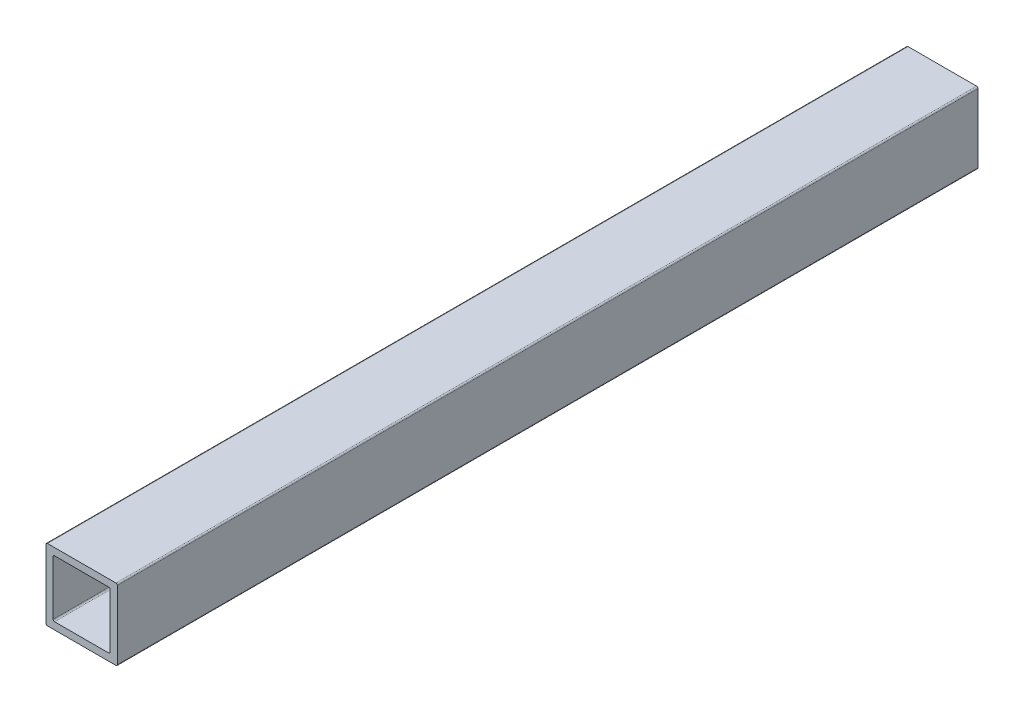
ISO-10303-21;
HEADER;
FILE_DESCRIPTION(('STEP AP214'),'2;1');
FILE_NAME('part.step','',(''),(''),'','','');
FILE_SCHEMA(('AUTOMOTIVE_DESIGN { 1 0 10303 214 1 1 1 1 }'));
ENDSEC;
DATA;
#1=APPLICATION_CONTEXT('core data for automotive mechanical design processes');
#2=APPLICATION_PROTOCOL_DEFINITION('international standard','automotive_design',2000,#1);
#3=PRODUCT_CONTEXT('',#1,'mechanical');
#4=PRODUCT('Part','Part','',(#3));
#5=PRODUCT_RELATED_PRODUCT_CATEGORY('part','',(#4));
#6=PRODUCT_DEFINITION_FORMATION('','',#4);
#7=PRODUCT_DEFINITION_CONTEXT('part definition',#1,'design');
#8=PRODUCT_DEFINITION('design','',#6,#7);
#9=PRODUCT_DEFINITION_SHAPE('','',#8);
#10=(LENGTH_UNIT() NAMED_UNIT(*) SI_UNIT(.MILLI.,.METRE.));
#11=(NAMED_UNIT(*) PLANE_ANGLE_UNIT() SI_UNIT($,.RADIAN.));
#12=(NAMED_UNIT(*) SI_UNIT($,.STERADIAN.) SOLID_ANGLE_UNIT());
#13=UNCERTAINTY_MEASURE_WITH_UNIT(LENGTH_MEASURE(1.E-05),#10,'distance_accuracy_value','');
#14=(GEOMETRIC_REPRESENTATION_CONTEXT(3) GLOBAL_UNCERTAINTY_ASSIGNED_CONTEXT((#13)) GLOBAL_UNIT_ASSIGNED_CONTEXT((#10,
#11,#12)) REPRESENTATION_CONTEXT('',''));
#15=CARTESIAN_POINT('',(0.,0.,0.));
#16=DIRECTION('',(0.,0.,1.));
#17=DIRECTION('',(1.,0.,0.));
#18=AXIS2_PLACEMENT_3D('',#15,#16,#17);
#19=CARTESIAN_POINT('',(0.,0.,120.57));
#20=DIRECTION('',(0.,0.,1.));
#21=DIRECTION('',(1.,0.,0.));
#22=AXIS2_PLACEMENT_3D('',#19,#20,#21);
#23=PLANE('',#22);
#24=DIRECTION('',(0.,-1.,0.));
#25=VECTOR('',#24,1.);
#26=CARTESIAN_POINT('',(-5.,5.,120.57));
#27=LINE('',#26,#25);
#28=CARTESIAN_POINT('',(-5.,4.8,120.57));
#29=VERTEX_POINT('',#28);
#30=CARTESIAN_POINT('',(-5.,-4.8,120.57));
#31=VERTEX_POINT('',#30);
#32=EDGE_CURVE('E262',#29,#31,#27,.T.);
#33=ORIENTED_EDGE('',*,*,#32,.T.);
#34=CARTESIAN_POINT('',(-4.8,-4.8,120.57));
#35=DIRECTION('',(0.,0.,1.));
#36=DIRECTION('',(1.,0.,0.));
#37=AXIS2_PLACEMENT_3D('',#34,#35,#36);
#38=CIRCLE('',#37,0.2);
#39=CARTESIAN_POINT('',(-4.8,-5.,120.57));
#40=VERTEX_POINT('',#39);
#41=EDGE_CURVE('E212',#31,#40,#38,.T.);
#42=ORIENTED_EDGE('',*,*,#41,.T.);
#43=DIRECTION('',(1.,0.,0.));
#44=VECTOR('',#43,1.);
#45=CARTESIAN_POINT('',(-5.,-5.,120.57));
#46=LINE('',#45,#44);
#47=CARTESIAN_POINT('',(4.8,-5.,120.57));
#48=VERTEX_POINT('',#47);
#49=EDGE_CURVE('E265',#40,#48,#46,.T.);
#50=ORIENTED_EDGE('',*,*,#49,.T.);
#51=CARTESIAN_POINT('',(4.8,-4.8,120.57));
#52=DIRECTION('',(0.,0.,1.));
#53=DIRECTION('',(1.,0.,0.));
#54=AXIS2_PLACEMENT_3D('',#51,#52,#53);
#55=CIRCLE('',#54,0.2);
#56=CARTESIAN_POINT('',(5.,-4.8,120.57));
#57=VERTEX_POINT('',#56);
#58=EDGE_CURVE('E210',#48,#57,#55,.T.);
#59=ORIENTED_EDGE('',*,*,#58,.T.);
#60=DIRECTION('',(0.,1.,0.));
#61=VECTOR('',#60,1.);
#62=CARTESIAN_POINT('',(5.,5.,120.57));
#63=LINE('',#62,#61);
#64=CARTESIAN_POINT('',(5.,4.8,120.57));
#65=VERTEX_POINT('',#64);
#66=EDGE_CURVE('E173',#57,#65,#63,.T.);
#67=ORIENTED_EDGE('',*,*,#66,.T.);
#68=CARTESIAN_POINT('',(4.8,4.8,120.57));
#69=DIRECTION('',(0.,0.,1.));
#70=DIRECTION('',(1.,0.,0.));
#71=AXIS2_PLACEMENT_3D('',#68,#69,#70);
#72=CIRCLE('',#71,0.2);
#73=CARTESIAN_POINT('',(4.8,5.,120.57));
#74=VERTEX_POINT('',#73);
#75=EDGE_CURVE('E206',#65,#74,#72,.T.);
#76=ORIENTED_EDGE('',*,*,#75,.T.);
#77=DIRECTION('',(-1.,0.,0.));
#78=VECTOR('',#77,1.);
#79=CARTESIAN_POINT('',(-5.,5.,120.57));
#80=LINE('',#79,#78);
#81=CARTESIAN_POINT('',(-4.8,5.,120.57));
#82=VERTEX_POINT('',#81);
#83=EDGE_CURVE('E168',#74,#82,#80,.T.);
#84=ORIENTED_EDGE('',*,*,#83,.T.);
#85=CARTESIAN_POINT('',(-4.8,4.8,120.57));
#86=DIRECTION('',(0.,0.,1.));
#87=DIRECTION('',(1.,0.,0.));
#88=AXIS2_PLACEMENT_3D('',#85,#86,#87);
#89=CIRCLE('',#88,0.2);
#90=EDGE_CURVE('E208',#82,#29,#89,.T.);
#91=ORIENTED_EDGE('',*,*,#90,.T.);
#92=EDGE_LOOP('',(#33,#42,#50,#59,#67,#76,#84,#91));
#93=FACE_BOUND('',#92,.T.);
#94=DIRECTION('',(1.,0.,0.));
#95=VECTOR('',#94,1.);
#96=CARTESIAN_POINT('',(-4.,-4.,120.57));
#97=LINE('',#96,#95);
#98=CARTESIAN_POINT('',(-3.8,-4.,120.57));
#99=VERTEX_POINT('',#98);
#100=CARTESIAN_POINT('',(3.8,-4.,120.57));
#101=VERTEX_POINT('',#100);
#102=EDGE_CURVE('E247',#99,#101,#97,.T.);
#103=ORIENTED_EDGE('',*,*,#102,.F.);
#104=CARTESIAN_POINT('',(-3.8,-3.8,120.57));
#105=DIRECTION('',(0.,0.,1.));
#106=DIRECTION('',(1.,0.,0.));
#107=AXIS2_PLACEMENT_3D('',#104,#105,#106);
#108=CIRCLE('',#107,0.2);
#109=CARTESIAN_POINT('',(-4.,-3.8,120.57));
#110=VERTEX_POINT('',#109);
#111=EDGE_CURVE('E11',#99,#110,#108,.F.);
#112=ORIENTED_EDGE('',*,*,#111,.T.);
#113=DIRECTION('',(0.,-1.,0.));
#114=VECTOR('',#113,1.);
#115=CARTESIAN_POINT('',(-4.,4.,120.57));
#116=LINE('',#115,#114);
#117=CARTESIAN_POINT('',(-4.,3.8,120.57));
#118=VERTEX_POINT('',#117);
#119=EDGE_CURVE('E245',#118,#110,#116,.T.);
#120=ORIENTED_EDGE('',*,*,#119,.F.);
#121=CARTESIAN_POINT('',(-3.8,3.8,120.57));
#122=DIRECTION('',(0.,0.,1.));
#123=DIRECTION('',(1.,0.,0.));
#124=AXIS2_PLACEMENT_3D('',#121,#122,#123);
#125=CIRCLE('',#124,0.2);
#126=CARTESIAN_POINT('',(-3.8,4.,120.57));
#127=VERTEX_POINT('',#126);
#128=EDGE_CURVE('E156',#118,#127,#125,.F.);
#129=ORIENTED_EDGE('',*,*,#128,.T.);
#130=DIRECTION('',(-1.,0.,0.));
#131=VECTOR('',#130,1.);
#132=CARTESIAN_POINT('',(-4.,4.,120.57));
#133=LINE('',#132,#131);
#134=CARTESIAN_POINT('',(3.8,4.,120.57));
#135=VERTEX_POINT('',#134);
#136=EDGE_CURVE('E257',#135,#127,#133,.T.);
#137=ORIENTED_EDGE('',*,*,#136,.F.);
#138=CARTESIAN_POINT('',(3.8,3.8,120.57));
#139=DIRECTION('',(0.,0.,1.));
#140=DIRECTION('',(1.,0.,0.));
#141=AXIS2_PLACEMENT_3D('',#138,#139,#140);
#142=CIRCLE('',#141,0.2);
#143=CARTESIAN_POINT('',(4.,3.8,120.57));
#144=VERTEX_POINT('',#143);
#145=EDGE_CURVE('E229',#135,#144,#142,.F.);
#146=ORIENTED_EDGE('',*,*,#145,.T.);
#147=DIRECTION('',(0.,1.,0.));
#148=VECTOR('',#147,1.);
#149=CARTESIAN_POINT('',(4.,4.,120.57));
#150=LINE('',#149,#148);
#151=CARTESIAN_POINT('',(4.,-3.8,120.57));
#152=VERTEX_POINT('',#151);
#153=EDGE_CURVE('E252',#152,#144,#150,.T.);
#154=ORIENTED_EDGE('',*,*,#153,.F.);
#155=CARTESIAN_POINT('',(3.8,-3.8,120.57));
#156=DIRECTION('',(0.,0.,1.));
#157=DIRECTION('',(1.,0.,0.));
#158=AXIS2_PLACEMENT_3D('',#155,#156,#157);
#159=CIRCLE('',#158,0.2);
#160=EDGE_CURVE('E47',#152,#101,#159,.F.);
#161=ORIENTED_EDGE('',*,*,#160,.T.);
#162=EDGE_LOOP('',(#103,#112,#120,#129,#137,#146,#154,#161));
#163=FACE_BOUND('',#162,.T.);
#164=ADVANCED_FACE('F32',(#93,#163),#23,.T.);
#165=CARTESIAN_POINT('',(0.,0.,0.));
#166=DIRECTION('',(0.,0.,1.));
#167=DIRECTION('',(1.,0.,0.));
#168=AXIS2_PLACEMENT_3D('',#165,#166,#167);
#169=PLANE('',#168);
#170=DIRECTION('',(1.,0.,0.));
#171=VECTOR('',#170,1.);
#172=CARTESIAN_POINT('',(-5.,-5.,0.));
#173=LINE('',#172,#171);
#174=CARTESIAN_POINT('',(-4.8,-5.,0.));
#175=VERTEX_POINT('',#174);
#176=CARTESIAN_POINT('',(4.8,-5.,0.));
#177=VERTEX_POINT('',#176);
#178=EDGE_CURVE('E272',#175,#177,#173,.T.);
#179=ORIENTED_EDGE('',*,*,#178,.F.);
#180=CARTESIAN_POINT('',(-4.8,-4.8,0.));
#181=DIRECTION('',(0.,0.,1.));
#182=DIRECTION('',(1.,0.,0.));
#183=AXIS2_PLACEMENT_3D('',#180,#181,#182);
#184=CIRCLE('',#183,0.2);
#185=CARTESIAN_POINT('',(-5.,-4.8,0.));
#186=VERTEX_POINT('',#185);
#187=EDGE_CURVE('E199',#175,#186,#184,.F.);
#188=ORIENTED_EDGE('',*,*,#187,.T.);
#189=DIRECTION('',(0.,-1.,0.));
#190=VECTOR('',#189,1.);
#191=CARTESIAN_POINT('',(-5.,5.,0.));
#192=LINE('',#191,#190);
#193=CARTESIAN_POINT('',(-5.,4.8,0.));
#194=VERTEX_POINT('',#193);
#195=EDGE_CURVE('E260',#194,#186,#192,.T.);
#196=ORIENTED_EDGE('',*,*,#195,.F.);
#197=CARTESIAN_POINT('',(-4.8,4.8,0.));
#198=DIRECTION('',(0.,0.,1.));
#199=DIRECTION('',(1.,0.,0.));
#200=AXIS2_PLACEMENT_3D('',#197,#198,#199);
#201=CIRCLE('',#200,0.2);
#202=CARTESIAN_POINT('',(-4.8,5.,0.));
#203=VERTEX_POINT('',#202);
#204=EDGE_CURVE('E195',#194,#203,#201,.F.);
#205=ORIENTED_EDGE('',*,*,#204,.T.);
#206=DIRECTION('',(-1.,0.,0.));
#207=VECTOR('',#206,1.);
#208=CARTESIAN_POINT('',(-5.,5.,0.));
#209=LINE('',#208,#207);
#210=CARTESIAN_POINT('',(4.8,5.,0.));
#211=VERTEX_POINT('',#210);
#212=EDGE_CURVE('E176',#211,#203,#209,.T.);
#213=ORIENTED_EDGE('',*,*,#212,.F.);
#214=CARTESIAN_POINT('',(4.8,4.8,0.));
#215=DIRECTION('',(0.,0.,1.));
#216=DIRECTION('',(1.,0.,0.));
#217=AXIS2_PLACEMENT_3D('',#214,#215,#216);
#218=CIRCLE('',#217,0.2);
#219=CARTESIAN_POINT('',(5.,4.8,0.));
#220=VERTEX_POINT('',#219);
#221=EDGE_CURVE('E193',#211,#220,#218,.F.);
#222=ORIENTED_EDGE('',*,*,#221,.T.);
#223=DIRECTION('',(0.,1.,0.));
#224=VECTOR('',#223,1.);
#225=CARTESIAN_POINT('',(5.,5.,0.));
#226=LINE('',#225,#224);
#227=CARTESIAN_POINT('',(5.,-4.8,0.));
#228=VERTEX_POINT('',#227);
#229=EDGE_CURVE('E274',#228,#220,#226,.T.);
#230=ORIENTED_EDGE('',*,*,#229,.F.);
#231=CARTESIAN_POINT('',(4.8,-4.8,0.));
#232=DIRECTION('',(0.,0.,1.));
#233=DIRECTION('',(1.,0.,0.));
#234=AXIS2_PLACEMENT_3D('',#231,#232,#233);
#235=CIRCLE('',#234,0.2);
#236=EDGE_CURVE('E197',#228,#177,#235,.F.);
#237=ORIENTED_EDGE('',*,*,#236,.T.);
#238=EDGE_LOOP('',(#179,#188,#196,#205,#213,#222,#230,#237));
#239=FACE_BOUND('',#238,.T.);
#240=DIRECTION('',(-1.,0.,0.));
#241=VECTOR('',#240,1.);
#242=CARTESIAN_POINT('',(-4.,4.,0.));
#243=LINE('',#242,#241);
#244=CARTESIAN_POINT('',(3.8,4.,0.));
#245=VERTEX_POINT('',#244);
#246=CARTESIAN_POINT('',(-3.8,4.,0.));
#247=VERTEX_POINT('',#246);
#248=EDGE_CURVE('E165',#245,#247,#243,.T.);
#249=ORIENTED_EDGE('',*,*,#248,.T.);
#250=CARTESIAN_POINT('',(-3.8,3.8,0.));
#251=DIRECTION('',(0.,0.,1.));
#252=DIRECTION('',(1.,0.,0.));
#253=AXIS2_PLACEMENT_3D('',#250,#251,#252);
#254=CIRCLE('',#253,0.2);
#255=CARTESIAN_POINT('',(-4.,3.8,0.));
#256=VERTEX_POINT('',#255);
#257=EDGE_CURVE('E231',#247,#256,#254,.T.);
#258=ORIENTED_EDGE('',*,*,#257,.T.);
#259=DIRECTION('',(0.,-1.,0.));
#260=VECTOR('',#259,1.);
#261=CARTESIAN_POINT('',(-4.,4.,0.));
#262=LINE('',#261,#260);
#263=CARTESIAN_POINT('',(-4.,-3.8,0.));
#264=VERTEX_POINT('',#263);
#265=EDGE_CURVE('E236',#256,#264,#262,.T.);
#266=ORIENTED_EDGE('',*,*,#265,.T.);
#267=CARTESIAN_POINT('',(-3.8,-3.8,0.));
#268=DIRECTION('',(0.,0.,1.));
#269=DIRECTION('',(1.,0.,0.));
#270=AXIS2_PLACEMENT_3D('',#267,#268,#269);
#271=CIRCLE('',#270,0.2);
#272=CARTESIAN_POINT('',(-3.8,-4.,0.));
#273=VERTEX_POINT('',#272);
#274=EDGE_CURVE('E40',#264,#273,#271,.T.);
#275=ORIENTED_EDGE('',*,*,#274,.T.);
#276=DIRECTION('',(1.,0.,0.));
#277=VECTOR('',#276,1.);
#278=CARTESIAN_POINT('',(-4.,-4.,0.));
#279=LINE('',#278,#277);
#280=CARTESIAN_POINT('',(3.8,-4.,0.));
#281=VERTEX_POINT('',#280);
#282=EDGE_CURVE('E151',#273,#281,#279,.T.);
#283=ORIENTED_EDGE('',*,*,#282,.T.);
#284=CARTESIAN_POINT('',(3.8,-3.8,0.));
#285=DIRECTION('',(0.,0.,1.));
#286=DIRECTION('',(1.,0.,0.));
#287=AXIS2_PLACEMENT_3D('',#284,#285,#286);
#288=CIRCLE('',#287,0.2);
#289=CARTESIAN_POINT('',(4.,-3.8,0.));
#290=VERTEX_POINT('',#289);
#291=EDGE_CURVE('E146',#281,#290,#288,.T.);
#292=ORIENTED_EDGE('',*,*,#291,.T.);
#293=DIRECTION('',(0.,1.,0.));
#294=VECTOR('',#293,1.);
#295=CARTESIAN_POINT('',(4.,4.,0.));
#296=LINE('',#295,#294);
#297=CARTESIAN_POINT('',(4.,3.8,0.));
#298=VERTEX_POINT('',#297);
#299=EDGE_CURVE('E150',#290,#298,#296,.T.);
#300=ORIENTED_EDGE('',*,*,#299,.T.);
#301=CARTESIAN_POINT('',(3.8,3.8,0.));
#302=DIRECTION('',(0.,0.,1.));
#303=DIRECTION('',(1.,0.,0.));
#304=AXIS2_PLACEMENT_3D('',#301,#302,#303);
#305=CIRCLE('',#304,0.2);
#306=EDGE_CURVE('E227',#298,#245,#305,.T.);
#307=ORIENTED_EDGE('',*,*,#306,.T.);
#308=EDGE_LOOP('',(#249,#258,#266,#275,#283,#292,#300,#307));
#309=FACE_BOUND('',#308,.T.);
#310=ADVANCED_FACE('F149',(#239,#309),#169,.F.);
#311=CARTESIAN_POINT('',(-5.,5.,120.57));
#312=DIRECTION('',(1.,0.,0.));
#313=DIRECTION('',(0.,1.,0.));
#314=AXIS2_PLACEMENT_3D('',#311,#312,#313);
#315=PLANE('',#314);
#316=ORIENTED_EDGE('',*,*,#195,.T.);
#317=DIRECTION('',(0.,0.,-1.));
#318=VECTOR('',#317,1.);
#319=CARTESIAN_POINT('',(-5.,-4.8,120.57));
#320=LINE('',#319,#318);
#321=EDGE_CURVE('E204',#186,#31,#320,.F.);
#322=ORIENTED_EDGE('',*,*,#321,.T.);
#323=ORIENTED_EDGE('',*,*,#32,.F.);
#324=DIRECTION('',(0.,0.,-1.));
#325=VECTOR('',#324,1.);
#326=CARTESIAN_POINT('',(-5.,4.8,120.57));
#327=LINE('',#326,#325);
#328=EDGE_CURVE('E201',#29,#194,#327,.T.);
#329=ORIENTED_EDGE('',*,*,#328,.T.);
#330=EDGE_LOOP('',(#316,#322,#323,#329));
#331=FACE_BOUND('',#330,.T.);
#332=ADVANCED_FACE('F295',(#331),#315,.F.);
#333=CARTESIAN_POINT('',(-5.,-5.,120.57));
#334=DIRECTION('',(0.,1.,0.));
#335=DIRECTION('',(-1.,0.,0.));
#336=AXIS2_PLACEMENT_3D('',#333,#334,#335);
#337=PLANE('',#336);
#338=ORIENTED_EDGE('',*,*,#49,.F.);
#339=DIRECTION('',(0.,0.,-1.));
#340=VECTOR('',#339,1.);
#341=CARTESIAN_POINT('',(-4.8,-5.,120.57));
#342=LINE('',#341,#340);
#343=EDGE_CURVE('E190',#40,#175,#342,.T.);
#344=ORIENTED_EDGE('',*,*,#343,.T.);
#345=ORIENTED_EDGE('',*,*,#178,.T.);
#346=DIRECTION('',(0.,0.,-1.));
#347=VECTOR('',#346,1.);
#348=CARTESIAN_POINT('',(4.8,-5.,120.57));
#349=LINE('',#348,#347);
#350=EDGE_CURVE('E188',#177,#48,#349,.F.);
#351=ORIENTED_EDGE('',*,*,#350,.T.);
#352=EDGE_LOOP('',(#338,#344,#345,#351));
#353=FACE_BOUND('',#352,.T.);
#354=ADVANCED_FACE('F304',(#353),#337,.F.);
#355=CARTESIAN_POINT('',(5.,5.,120.57));
#356=DIRECTION('',(-1.,0.,0.));
#357=DIRECTION('',(0.,-1.,0.));
#358=AXIS2_PLACEMENT_3D('',#355,#356,#357);
#359=PLANE('',#358);
#360=ORIENTED_EDGE('',*,*,#66,.F.);
#361=DIRECTION('',(0.,0.,-1.));
#362=VECTOR('',#361,1.);
#363=CARTESIAN_POINT('',(5.,-4.8,120.57));
#364=LINE('',#363,#362);
#365=EDGE_CURVE('E219',#57,#228,#364,.T.);
#366=ORIENTED_EDGE('',*,*,#365,.T.);
#367=ORIENTED_EDGE('',*,*,#229,.T.);
#368=DIRECTION('',(0.,0.,-1.));
#369=VECTOR('',#368,1.);
#370=CARTESIAN_POINT('',(5.,4.8,120.57));
#371=LINE('',#370,#369);
#372=EDGE_CURVE('E217',#220,#65,#371,.F.);
#373=ORIENTED_EDGE('',*,*,#372,.T.);
#374=EDGE_LOOP('',(#360,#366,#367,#373));
#375=FACE_BOUND('',#374,.T.);
#376=ADVANCED_FACE('F312',(#375),#359,.F.);
#377=CARTESIAN_POINT('',(-5.,5.,120.57));
#378=DIRECTION('',(0.,-1.,0.));
#379=DIRECTION('',(1.,0.,0.));
#380=AXIS2_PLACEMENT_3D('',#377,#378,#379);
#381=PLANE('',#380);
#382=ORIENTED_EDGE('',*,*,#212,.T.);
#383=DIRECTION('',(0.,0.,-1.));
#384=VECTOR('',#383,1.);
#385=CARTESIAN_POINT('',(-4.8,5.,120.57));
#386=LINE('',#385,#384);
#387=EDGE_CURVE('E225',#203,#82,#386,.F.);
#388=ORIENTED_EDGE('',*,*,#387,.T.);
#389=ORIENTED_EDGE('',*,*,#83,.F.);
#390=DIRECTION('',(0.,0.,-1.));
#391=VECTOR('',#390,1.);
#392=CARTESIAN_POINT('',(4.8,5.,120.57));
#393=LINE('',#392,#391);
#394=EDGE_CURVE('E222',#74,#211,#393,.T.);
#395=ORIENTED_EDGE('',*,*,#394,.T.);
#396=EDGE_LOOP('',(#382,#388,#389,#395));
#397=FACE_BOUND('',#396,.T.);
#398=ADVANCED_FACE('F283',(#397),#381,.F.);
#399=CARTESIAN_POINT('',(-4.,4.,120.57));
#400=DIRECTION('',(1.,0.,0.));
#401=DIRECTION('',(0.,1.,0.));
#402=AXIS2_PLACEMENT_3D('',#399,#400,#401);
#403=PLANE('',#402);
#404=ORIENTED_EDGE('',*,*,#265,.F.);
#405=DIRECTION('',(0.,0.,-1.));
#406=VECTOR('',#405,1.);
#407=CARTESIAN_POINT('',(-4.,3.8,120.57));
#408=LINE('',#407,#406);
#409=EDGE_CURVE('E186',#256,#118,#408,.F.);
#410=ORIENTED_EDGE('',*,*,#409,.T.);
#411=ORIENTED_EDGE('',*,*,#119,.T.);
#412=DIRECTION('',(0.,0.,-1.));
#413=VECTOR('',#412,1.);
#414=CARTESIAN_POINT('',(-4.,-3.8,0.));
#415=LINE('',#414,#413);
#416=EDGE_CURVE('E183',#110,#264,#415,.T.);
#417=ORIENTED_EDGE('',*,*,#416,.T.);
#418=EDGE_LOOP('',(#404,#410,#411,#417));
#419=FACE_BOUND('',#418,.T.);
#420=ADVANCED_FACE('F249',(#419),#403,.T.);
#421=CARTESIAN_POINT('',(-4.,-4.,120.57));
#422=DIRECTION('',(0.,1.,0.));
#423=DIRECTION('',(0.,0.,1.));
#424=AXIS2_PLACEMENT_3D('',#421,#422,#423);
#425=PLANE('',#424);
#426=ORIENTED_EDGE('',*,*,#102,.T.);
#427=DIRECTION('',(0.,0.,-1.));
#428=VECTOR('',#427,1.);
#429=CARTESIAN_POINT('',(3.8,-4.,0.));
#430=LINE('',#429,#428);
#431=EDGE_CURVE('E215',#101,#281,#430,.T.);
#432=ORIENTED_EDGE('',*,*,#431,.T.);
#433=ORIENTED_EDGE('',*,*,#282,.F.);
#434=DIRECTION('',(0.,0.,-1.));
#435=VECTOR('',#434,1.);
#436=CARTESIAN_POINT('',(-3.8,-4.,120.57));
#437=LINE('',#436,#435);
#438=EDGE_CURVE('E54',#273,#99,#437,.F.);
#439=ORIENTED_EDGE('',*,*,#438,.T.);
#440=EDGE_LOOP('',(#426,#432,#433,#439));
#441=FACE_BOUND('',#440,.T.);
#442=ADVANCED_FACE('F239',(#441),#425,.T.);
#443=CARTESIAN_POINT('',(4.,4.,120.57));
#444=DIRECTION('',(-1.,0.,0.));
#445=DIRECTION('',(0.,-1.,0.));
#446=AXIS2_PLACEMENT_3D('',#443,#444,#445);
#447=PLANE('',#446);
#448=ORIENTED_EDGE('',*,*,#153,.T.);
#449=DIRECTION('',(0.,0.,-1.));
#450=VECTOR('',#449,1.);
#451=CARTESIAN_POINT('',(4.,3.8,0.));
#452=LINE('',#451,#450);
#453=EDGE_CURVE('E164',#144,#298,#452,.T.);
#454=ORIENTED_EDGE('',*,*,#453,.T.);
#455=ORIENTED_EDGE('',*,*,#299,.F.);
#456=DIRECTION('',(0.,0.,-1.));
#457=VECTOR('',#456,1.);
#458=CARTESIAN_POINT('',(4.,-3.8,120.57));
#459=LINE('',#458,#457);
#460=EDGE_CURVE('E162',#290,#152,#459,.F.);
#461=ORIENTED_EDGE('',*,*,#460,.T.);
#462=EDGE_LOOP('',(#448,#454,#455,#461));
#463=FACE_BOUND('',#462,.T.);
#464=ADVANCED_FACE('F161',(#463),#447,.T.);
#465=CARTESIAN_POINT('',(-4.,4.,120.57));
#466=DIRECTION('',(0.,-1.,0.));
#467=DIRECTION('',(0.,0.,-1.));
#468=AXIS2_PLACEMENT_3D('',#465,#466,#467);
#469=PLANE('',#468);
#470=ORIENTED_EDGE('',*,*,#248,.F.);
#471=DIRECTION('',(0.,0.,-1.));
#472=VECTOR('',#471,1.);
#473=CARTESIAN_POINT('',(3.8,4.,120.57));
#474=LINE('',#473,#472);
#475=EDGE_CURVE('E181',#245,#135,#474,.F.);
#476=ORIENTED_EDGE('',*,*,#475,.T.);
#477=ORIENTED_EDGE('',*,*,#136,.T.);
#478=DIRECTION('',(0.,0.,-1.));
#479=VECTOR('',#478,1.);
#480=CARTESIAN_POINT('',(-3.8,4.,0.));
#481=LINE('',#480,#479);
#482=EDGE_CURVE('E170',#127,#247,#481,.T.);
#483=ORIENTED_EDGE('',*,*,#482,.T.);
#484=EDGE_LOOP('',(#470,#476,#477,#483));
#485=FACE_BOUND('',#484,.T.);
#486=ADVANCED_FACE('F334',(#485),#469,.T.);
#487=CARTESIAN_POINT('',(3.8,3.8,120.57));
#488=DIRECTION('',(0.,0.,1.));
#489=DIRECTION('',(1.,0.,0.));
#490=AXIS2_PLACEMENT_3D('',#487,#488,#489);
#491=CYLINDRICAL_SURFACE('',#490,0.2);
#492=ORIENTED_EDGE('',*,*,#145,.F.);
#493=ORIENTED_EDGE('',*,*,#475,.F.);
#494=ORIENTED_EDGE('',*,*,#306,.F.);
#495=ORIENTED_EDGE('',*,*,#453,.F.);
#496=EDGE_LOOP('',(#492,#493,#494,#495));
#497=FACE_BOUND('',#496,.T.);
#498=ADVANCED_FACE('F330',(#497),#491,.F.);
#499=CARTESIAN_POINT('',(-3.8,3.8,120.57));
#500=DIRECTION('',(0.,0.,1.));
#501=DIRECTION('',(1.,0.,0.));
#502=AXIS2_PLACEMENT_3D('',#499,#500,#501);
#503=CYLINDRICAL_SURFACE('',#502,0.2);
#504=ORIENTED_EDGE('',*,*,#128,.F.);
#505=ORIENTED_EDGE('',*,*,#409,.F.);
#506=ORIENTED_EDGE('',*,*,#257,.F.);
#507=ORIENTED_EDGE('',*,*,#482,.F.);
#508=EDGE_LOOP('',(#504,#505,#506,#507));
#509=FACE_BOUND('',#508,.T.);
#510=ADVANCED_FACE('F333',(#509),#503,.F.);
#511=CARTESIAN_POINT('',(-4.8,-4.8,120.57));
#512=DIRECTION('',(0.,0.,-1.));
#513=DIRECTION('',(-1.,0.,0.));
#514=AXIS2_PLACEMENT_3D('',#511,#512,#513);
#515=CYLINDRICAL_SURFACE('',#514,0.2);
#516=ORIENTED_EDGE('',*,*,#41,.F.);
#517=ORIENTED_EDGE('',*,*,#321,.F.);
#518=ORIENTED_EDGE('',*,*,#187,.F.);
#519=ORIENTED_EDGE('',*,*,#343,.F.);
#520=EDGE_LOOP('',(#516,#517,#518,#519));
#521=FACE_BOUND('',#520,.T.);
#522=ADVANCED_FACE('F299',(#521),#515,.T.);
#523=CARTESIAN_POINT('',(3.8,-3.8,120.57));
#524=DIRECTION('',(0.,0.,1.));
#525=DIRECTION('',(1.,0.,0.));
#526=AXIS2_PLACEMENT_3D('',#523,#524,#525);
#527=CYLINDRICAL_SURFACE('',#526,0.2);
#528=ORIENTED_EDGE('',*,*,#160,.F.);
#529=ORIENTED_EDGE('',*,*,#460,.F.);
#530=ORIENTED_EDGE('',*,*,#291,.F.);
#531=ORIENTED_EDGE('',*,*,#431,.F.);
#532=EDGE_LOOP('',(#528,#529,#530,#531));
#533=FACE_BOUND('',#532,.T.);
#534=ADVANCED_FACE('F167',(#533),#527,.F.);
#535=CARTESIAN_POINT('',(4.8,-4.8,120.57));
#536=DIRECTION('',(0.,0.,-1.));
#537=DIRECTION('',(-1.,0.,0.));
#538=AXIS2_PLACEMENT_3D('',#535,#536,#537);
#539=CYLINDRICAL_SURFACE('',#538,0.2);
#540=ORIENTED_EDGE('',*,*,#58,.F.);
#541=ORIENTED_EDGE('',*,*,#350,.F.);
#542=ORIENTED_EDGE('',*,*,#236,.F.);
#543=ORIENTED_EDGE('',*,*,#365,.F.);
#544=EDGE_LOOP('',(#540,#541,#542,#543));
#545=FACE_BOUND('',#544,.T.);
#546=ADVANCED_FACE('F308',(#545),#539,.T.);
#547=CARTESIAN_POINT('',(-4.8,4.8,120.57));
#548=DIRECTION('',(0.,0.,-1.));
#549=DIRECTION('',(-1.,0.,0.));
#550=AXIS2_PLACEMENT_3D('',#547,#548,#549);
#551=CYLINDRICAL_SURFACE('',#550,0.2);
#552=ORIENTED_EDGE('',*,*,#90,.F.);
#553=ORIENTED_EDGE('',*,*,#387,.F.);
#554=ORIENTED_EDGE('',*,*,#204,.F.);
#555=ORIENTED_EDGE('',*,*,#328,.F.);
#556=EDGE_LOOP('',(#552,#553,#554,#555));
#557=FACE_BOUND('',#556,.T.);
#558=ADVANCED_FACE('F289',(#557),#551,.T.);
#559=CARTESIAN_POINT('',(-3.8,-3.8,120.57));
#560=DIRECTION('',(0.,0.,1.));
#561=DIRECTION('',(1.,0.,0.));
#562=AXIS2_PLACEMENT_3D('',#559,#560,#561);
#563=CYLINDRICAL_SURFACE('',#562,0.2);
#564=ORIENTED_EDGE('',*,*,#111,.F.);
#565=ORIENTED_EDGE('',*,*,#438,.F.);
#566=ORIENTED_EDGE('',*,*,#274,.F.);
#567=ORIENTED_EDGE('',*,*,#416,.F.);
#568=EDGE_LOOP('',(#564,#565,#566,#567));
#569=FACE_BOUND('',#568,.T.);
#570=ADVANCED_FACE('F242',(#569),#563,.F.);
#571=CARTESIAN_POINT('',(4.8,4.8,120.57));
#572=DIRECTION('',(0.,0.,-1.));
#573=DIRECTION('',(-1.,0.,0.));
#574=AXIS2_PLACEMENT_3D('',#571,#572,#573);
#575=CYLINDRICAL_SURFACE('',#574,0.2);
#576=ORIENTED_EDGE('',*,*,#75,.F.);
#577=ORIENTED_EDGE('',*,*,#372,.F.);
#578=ORIENTED_EDGE('',*,*,#221,.F.);
#579=ORIENTED_EDGE('',*,*,#394,.F.);
#580=EDGE_LOOP('',(#576,#577,#578,#579));
#581=FACE_BOUND('',#580,.T.);
#582=ADVANCED_FACE('F34',(#581),#575,.T.);
#583=CLOSED_SHELL('',(#164,#310,#332,#354,#376,#398,#420,#442,#464,#486,#498,#510,#522,#534,
#546,#558,#570,#582));
#584=MANIFOLD_SOLID_BREP('B2',#583);
#585=ADVANCED_BREP_SHAPE_REPRESENTATION('',(#18,#584),#14);
#586=SHAPE_DEFINITION_REPRESENTATION(#9,#585);
ENDSEC;
END-ISO-10303-21;
